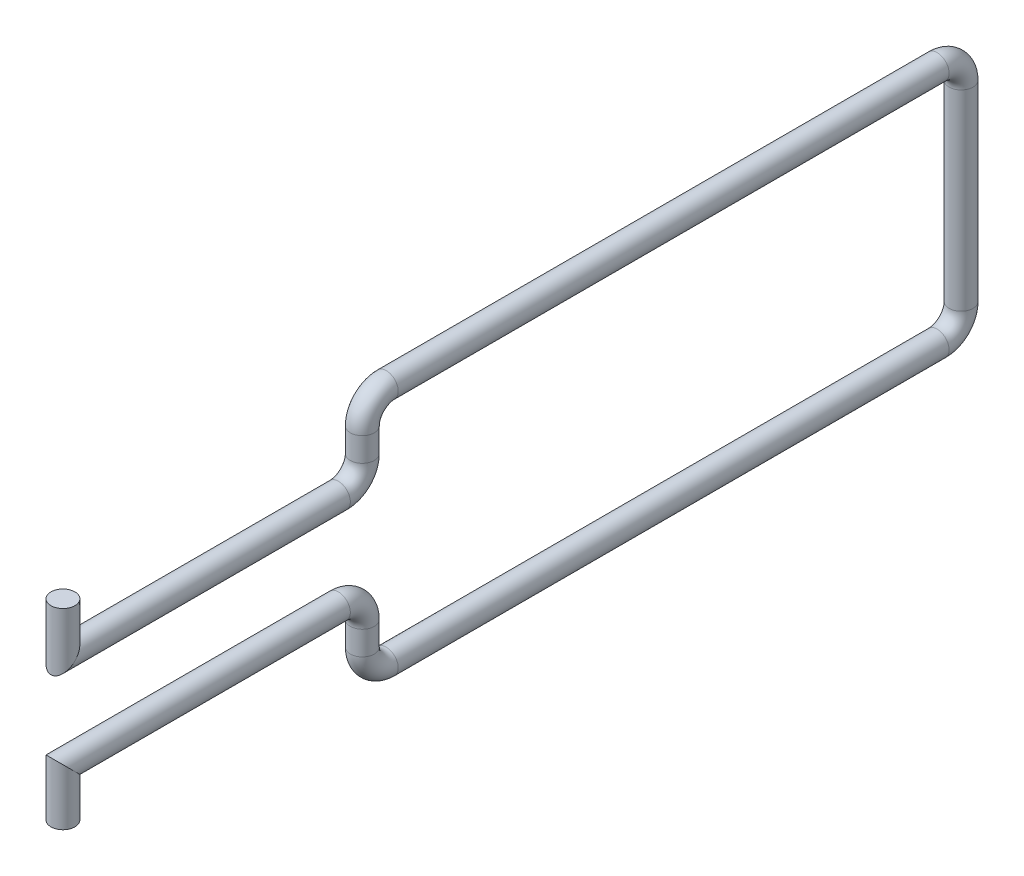
ISO-10303-21;
HEADER;
FILE_DESCRIPTION(('STEP AP214'),'2;1');
FILE_NAME('part.step','',(''),(''),'','','');
FILE_SCHEMA(('AUTOMOTIVE_DESIGN { 1 0 10303 214 1 1 1 1 }'));
ENDSEC;
DATA;
#1=APPLICATION_CONTEXT('core data for automotive mechanical design processes');
#2=APPLICATION_PROTOCOL_DEFINITION('international standard','automotive_design',2000,#1);
#3=PRODUCT_CONTEXT('',#1,'mechanical');
#4=PRODUCT('Part','Part','',(#3));
#5=PRODUCT_RELATED_PRODUCT_CATEGORY('part','',(#4));
#6=PRODUCT_DEFINITION_FORMATION('','',#4);
#7=PRODUCT_DEFINITION_CONTEXT('part definition',#1,'design');
#8=PRODUCT_DEFINITION('design','',#6,#7);
#9=PRODUCT_DEFINITION_SHAPE('','',#8);
#10=(LENGTH_UNIT() NAMED_UNIT(*) SI_UNIT(.MILLI.,.METRE.));
#11=(NAMED_UNIT(*) PLANE_ANGLE_UNIT() SI_UNIT($,.RADIAN.));
#12=(NAMED_UNIT(*) SI_UNIT($,.STERADIAN.) SOLID_ANGLE_UNIT());
#13=UNCERTAINTY_MEASURE_WITH_UNIT(LENGTH_MEASURE(1.E-05),#10,'distance_accuracy_value','');
#14=(GEOMETRIC_REPRESENTATION_CONTEXT(3) GLOBAL_UNCERTAINTY_ASSIGNED_CONTEXT((#13)) GLOBAL_UNIT_ASSIGNED_CONTEXT((#10,
#11,#12)) REPRESENTATION_CONTEXT('',''));
#15=CARTESIAN_POINT('',(0.,0.,0.));
#16=DIRECTION('',(0.,0.,1.));
#17=DIRECTION('',(1.,0.,0.));
#18=AXIS2_PLACEMENT_3D('',#15,#16,#17);
#19=CARTESIAN_POINT('',(0.,-3.99999999999999,0.));
#20=DIRECTION('',(0.,-1.,0.));
#21=DIRECTION('',(0.,0.,-1.));
#22=AXIS2_PLACEMENT_3D('',#19,#20,#21);
#23=CYLINDRICAL_SURFACE('',#22,1.);
#24=CARTESIAN_POINT('',(0.,-3.99999999999999,0.));
#25=DIRECTION('',(0.,-0.707106781186548,0.707106781186547));
#26=DIRECTION('',(0.,0.707106781186547,0.707106781186548));
#27=AXIS2_PLACEMENT_3D('',#24,#25,#26);
#28=ELLIPSE('',#27,1.4142135623731,1.);
#29=CARTESIAN_POINT('',(0.,-2.99999999999999,1.00000000000001));
#30=VERTEX_POINT('',#29);
#31=EDGE_CURVE('E40',#30,#30,#28,.F.);
#32=ORIENTED_EDGE('',*,*,#31,.F.);
#33=EDGE_LOOP('',(#32));
#34=FACE_BOUND('',#33,.T.);
#35=CARTESIAN_POINT('',(0.,-8.00000000000001,0.));
#36=DIRECTION('',(0.,-1.,0.));
#37=DIRECTION('',(0.,0.,-1.));
#38=AXIS2_PLACEMENT_3D('',#35,#36,#37);
#39=CIRCLE('',#38,1.);
#40=CARTESIAN_POINT('',(0.,-8.00000000000001,-0.999999999999987));
#41=VERTEX_POINT('',#40);
#42=EDGE_CURVE('E11',#41,#41,#39,.T.);
#43=ORIENTED_EDGE('',*,*,#42,.F.);
#44=EDGE_LOOP('',(#43));
#45=FACE_BOUND('',#44,.T.);
#46=ADVANCED_FACE('F34',(#34,#45),#23,.T.);
#47=CARTESIAN_POINT('',(0.,-3.99999999999999,-23.));
#48=DIRECTION('',(0.,0.,1.));
#49=DIRECTION('',(0.,-1.,0.));
#50=AXIS2_PLACEMENT_3D('',#47,#48,#49);
#51=CYLINDRICAL_SURFACE('',#50,1.);
#52=CARTESIAN_POINT('',(0.,-3.99999999999999,-23.));
#53=DIRECTION('',(0.,0.,1.));
#54=DIRECTION('',(0.,-1.,0.));
#55=AXIS2_PLACEMENT_3D('',#52,#53,#54);
#56=CIRCLE('',#55,1.);
#57=CARTESIAN_POINT('',(0.,-2.99999999999999,-23.));
#58=VERTEX_POINT('',#57);
#59=EDGE_CURVE('E44',#58,#58,#56,.T.);
#60=ORIENTED_EDGE('',*,*,#59,.T.);
#61=EDGE_LOOP('',(#60));
#62=FACE_BOUND('',#61,.T.);
#63=ORIENTED_EDGE('',*,*,#31,.T.);
#64=EDGE_LOOP('',(#63));
#65=FACE_BOUND('',#64,.T.);
#66=ADVANCED_FACE('F168',(#62,#65),#51,.T.);
#67=CARTESIAN_POINT('',(0.,-6.00000000000001,-23.));
#68=DIRECTION('',(1.,0.,0.));
#69=DIRECTION('',(0.,0.,-1.));
#70=AXIS2_PLACEMENT_3D('',#67,#68,#69);
#71=TOROIDAL_SURFACE('',#70,2.00000000000002,1.);
#72=CARTESIAN_POINT('',(0.,-5.99999999999999,-25.));
#73=DIRECTION('',(0.,1.,0.));
#74=DIRECTION('',(0.,0.,1.));
#75=AXIS2_PLACEMENT_3D('',#72,#73,#74);
#76=CIRCLE('',#75,1.);
#77=CARTESIAN_POINT('',(0.,-5.99999999999998,-26.));
#78=VERTEX_POINT('',#77);
#79=EDGE_CURVE('E48',#78,#78,#76,.T.);
#80=CARTESIAN_POINT('',(0.,-6.00000000000001,-23.));
#81=DIRECTION('',(1.,0.,0.));
#82=DIRECTION('',(0.,0.,-1.));
#83=AXIS2_PLACEMENT_3D('',#80,#81,#82);
#84=CIRCLE('',#83,3.00000000000002);
#85=EDGE_CURVE('',#78,#58,#84,.T.);
#86=ORIENTED_EDGE('',*,*,#79,.T.);
#87=ORIENTED_EDGE('',*,*,#59,.F.);
#88=ORIENTED_EDGE('',*,*,#85,.T.);
#89=ORIENTED_EDGE('',*,*,#85,.F.);
#90=EDGE_LOOP('',(#86,#88,#87,#89));
#91=FACE_BOUND('',#90,.T.);
#92=ADVANCED_FACE('F162',(#91),#71,.T.);
#93=CARTESIAN_POINT('',(0.,-7.99999999999999,-25.));
#94=DIRECTION('',(0.,1.,0.));
#95=DIRECTION('',(0.,0.,1.));
#96=AXIS2_PLACEMENT_3D('',#93,#94,#95);
#97=CYLINDRICAL_SURFACE('',#96,1.);
#98=CARTESIAN_POINT('',(0.,-7.99999999999999,-25.));
#99=DIRECTION('',(0.,1.,0.));
#100=DIRECTION('',(0.,0.,1.));
#101=AXIS2_PLACEMENT_3D('',#98,#99,#100);
#102=CIRCLE('',#101,1.);
#103=CARTESIAN_POINT('',(0.,-7.99999999999998,-24.));
#104=VERTEX_POINT('',#103);
#105=EDGE_CURVE('E53',#104,#104,#102,.T.);
#106=ORIENTED_EDGE('',*,*,#105,.T.);
#107=EDGE_LOOP('',(#106));
#108=FACE_BOUND('',#107,.T.);
#109=ORIENTED_EDGE('',*,*,#79,.F.);
#110=EDGE_LOOP('',(#109));
#111=FACE_BOUND('',#110,.T.);
#112=ADVANCED_FACE('F156',(#108,#111),#97,.T.);
#113=CARTESIAN_POINT('',(0.,-8.00000000000001,-27.));
#114=DIRECTION('',(-1.,0.,0.));
#115=DIRECTION('',(0.,0.,1.));
#116=AXIS2_PLACEMENT_3D('',#113,#114,#115);
#117=TOROIDAL_SURFACE('',#116,1.99999999999998,1.);
#118=CARTESIAN_POINT('',(0.,-9.99999999999998,-27.));
#119=DIRECTION('',(0.,0.,1.));
#120=DIRECTION('',(0.,-1.,0.));
#121=AXIS2_PLACEMENT_3D('',#118,#119,#120);
#122=CIRCLE('',#121,1.);
#123=CARTESIAN_POINT('',(0.,-11.,-27.));
#124=VERTEX_POINT('',#123);
#125=EDGE_CURVE('E56',#124,#124,#122,.T.);
#126=CARTESIAN_POINT('',(0.,-8.00000000000001,-27.));
#127=DIRECTION('',(-1.,0.,0.));
#128=DIRECTION('',(0.,0.,1.));
#129=AXIS2_PLACEMENT_3D('',#126,#127,#128);
#130=CIRCLE('',#129,2.99999999999998);
#131=EDGE_CURVE('',#124,#104,#130,.T.);
#132=ORIENTED_EDGE('',*,*,#125,.T.);
#133=ORIENTED_EDGE('',*,*,#105,.F.);
#134=ORIENTED_EDGE('',*,*,#131,.T.);
#135=ORIENTED_EDGE('',*,*,#131,.F.);
#136=EDGE_LOOP('',(#132,#134,#133,#135));
#137=FACE_BOUND('',#136,.T.);
#138=ADVANCED_FACE('F150',(#137),#117,.T.);
#139=CARTESIAN_POINT('',(0.,-9.99999999999998,-73.));
#140=DIRECTION('',(0.,0.,1.));
#141=DIRECTION('',(0.,-1.,0.));
#142=AXIS2_PLACEMENT_3D('',#139,#140,#141);
#143=CYLINDRICAL_SURFACE('',#142,1.);
#144=CARTESIAN_POINT('',(0.,-9.99999999999998,-73.));
#145=DIRECTION('',(0.,0.,1.));
#146=DIRECTION('',(0.,-1.,0.));
#147=AXIS2_PLACEMENT_3D('',#144,#145,#146);
#148=CIRCLE('',#147,1.);
#149=CARTESIAN_POINT('',(0.,-11.,-73.));
#150=VERTEX_POINT('',#149);
#151=EDGE_CURVE('E59',#150,#150,#148,.T.);
#152=ORIENTED_EDGE('',*,*,#151,.T.);
#153=EDGE_LOOP('',(#152));
#154=FACE_BOUND('',#153,.T.);
#155=ORIENTED_EDGE('',*,*,#125,.F.);
#156=EDGE_LOOP('',(#155));
#157=FACE_BOUND('',#156,.T.);
#158=ADVANCED_FACE('F144',(#154,#157),#143,.T.);
#159=CARTESIAN_POINT('',(0.,-8.,-73.));
#160=DIRECTION('',(-1.,0.,0.));
#161=DIRECTION('',(0.,0.,1.));
#162=AXIS2_PLACEMENT_3D('',#159,#160,#161);
#163=TOROIDAL_SURFACE('',#162,1.99999999999999,1.);
#164=CARTESIAN_POINT('',(0.,-8.00000000000001,-75.));
#165=DIRECTION('',(0.,-1.,0.));
#166=DIRECTION('',(0.,0.,-1.));
#167=AXIS2_PLACEMENT_3D('',#164,#165,#166);
#168=CIRCLE('',#167,1.);
#169=CARTESIAN_POINT('',(0.,-8.00000000000001,-76.));
#170=VERTEX_POINT('',#169);
#171=EDGE_CURVE('E62',#170,#170,#168,.T.);
#172=CARTESIAN_POINT('',(0.,-8.,-73.));
#173=DIRECTION('',(-1.,0.,0.));
#174=DIRECTION('',(0.,0.,1.));
#175=AXIS2_PLACEMENT_3D('',#172,#173,#174);
#176=CIRCLE('',#175,2.99999999999999);
#177=EDGE_CURVE('',#170,#150,#176,.T.);
#178=ORIENTED_EDGE('',*,*,#171,.T.);
#179=ORIENTED_EDGE('',*,*,#151,.F.);
#180=ORIENTED_EDGE('',*,*,#177,.T.);
#181=ORIENTED_EDGE('',*,*,#177,.F.);
#182=EDGE_LOOP('',(#178,#180,#179,#181));
#183=FACE_BOUND('',#182,.T.);
#184=ADVANCED_FACE('F138',(#183),#163,.T.);
#185=CARTESIAN_POINT('',(0.,7.99999999999999,-75.));
#186=DIRECTION('',(0.,-1.,0.));
#187=DIRECTION('',(0.,0.,-1.));
#188=AXIS2_PLACEMENT_3D('',#185,#186,#187);
#189=CYLINDRICAL_SURFACE('',#188,1.);
#190=CARTESIAN_POINT('',(0.,7.99999999999999,-75.));
#191=DIRECTION('',(0.,-1.,0.));
#192=DIRECTION('',(0.,0.,-1.));
#193=AXIS2_PLACEMENT_3D('',#190,#191,#192);
#194=CIRCLE('',#193,1.);
#195=CARTESIAN_POINT('',(0.,7.99999999999999,-76.));
#196=VERTEX_POINT('',#195);
#197=EDGE_CURVE('E65',#196,#196,#194,.T.);
#198=ORIENTED_EDGE('',*,*,#197,.T.);
#199=EDGE_LOOP('',(#198));
#200=FACE_BOUND('',#199,.T.);
#201=ORIENTED_EDGE('',*,*,#171,.F.);
#202=EDGE_LOOP('',(#201));
#203=FACE_BOUND('',#202,.T.);
#204=ADVANCED_FACE('F132',(#200,#203),#189,.T.);
#205=CARTESIAN_POINT('',(0.,8.,-73.));
#206=DIRECTION('',(-1.,0.,0.));
#207=DIRECTION('',(0.,0.,1.));
#208=AXIS2_PLACEMENT_3D('',#205,#206,#207);
#209=TOROIDAL_SURFACE('',#208,2.,1.);
#210=CARTESIAN_POINT('',(0.,10.,-73.));
#211=DIRECTION('',(0.,0.,-1.));
#212=DIRECTION('',(0.,1.,0.));
#213=AXIS2_PLACEMENT_3D('',#210,#211,#212);
#214=CIRCLE('',#213,1.);
#215=CARTESIAN_POINT('',(0.,11.,-73.));
#216=VERTEX_POINT('',#215);
#217=EDGE_CURVE('E68',#216,#216,#214,.T.);
#218=CARTESIAN_POINT('',(0.,8.,-73.));
#219=DIRECTION('',(-1.,0.,0.));
#220=DIRECTION('',(0.,0.,1.));
#221=AXIS2_PLACEMENT_3D('',#218,#219,#220);
#222=CIRCLE('',#221,3.);
#223=EDGE_CURVE('',#216,#196,#222,.T.);
#224=ORIENTED_EDGE('',*,*,#217,.T.);
#225=ORIENTED_EDGE('',*,*,#197,.F.);
#226=ORIENTED_EDGE('',*,*,#223,.T.);
#227=ORIENTED_EDGE('',*,*,#223,.F.);
#228=EDGE_LOOP('',(#224,#226,#225,#227));
#229=FACE_BOUND('',#228,.T.);
#230=ADVANCED_FACE('F126',(#229),#209,.T.);
#231=CARTESIAN_POINT('',(0.,10.,-27.));
#232=DIRECTION('',(0.,0.,-1.));
#233=DIRECTION('',(0.,1.,0.));
#234=AXIS2_PLACEMENT_3D('',#231,#232,#233);
#235=CYLINDRICAL_SURFACE('',#234,1.);
#236=CARTESIAN_POINT('',(0.,10.,-27.));
#237=DIRECTION('',(0.,0.,-1.));
#238=DIRECTION('',(0.,1.,0.));
#239=AXIS2_PLACEMENT_3D('',#236,#237,#238);
#240=CIRCLE('',#239,1.);
#241=CARTESIAN_POINT('',(0.,11.,-27.));
#242=VERTEX_POINT('',#241);
#243=EDGE_CURVE('E71',#242,#242,#240,.T.);
#244=ORIENTED_EDGE('',*,*,#243,.T.);
#245=EDGE_LOOP('',(#244));
#246=FACE_BOUND('',#245,.T.);
#247=ORIENTED_EDGE('',*,*,#217,.F.);
#248=EDGE_LOOP('',(#247));
#249=FACE_BOUND('',#248,.T.);
#250=ADVANCED_FACE('F120',(#246,#249),#235,.T.);
#251=CARTESIAN_POINT('',(0.,8.,-27.));
#252=DIRECTION('',(-1.,0.,0.));
#253=DIRECTION('',(0.,0.,1.));
#254=AXIS2_PLACEMENT_3D('',#251,#252,#253);
#255=TOROIDAL_SURFACE('',#254,2.,1.);
#256=CARTESIAN_POINT('',(0.,8.,-25.));
#257=DIRECTION('',(0.,1.,0.));
#258=DIRECTION('',(0.,0.,1.));
#259=AXIS2_PLACEMENT_3D('',#256,#257,#258);
#260=CIRCLE('',#259,1.);
#261=CARTESIAN_POINT('',(0.,8.,-24.));
#262=VERTEX_POINT('',#261);
#263=EDGE_CURVE('E74',#262,#262,#260,.T.);
#264=CARTESIAN_POINT('',(0.,8.,-27.));
#265=DIRECTION('',(-1.,0.,0.));
#266=DIRECTION('',(0.,0.,1.));
#267=AXIS2_PLACEMENT_3D('',#264,#265,#266);
#268=CIRCLE('',#267,3.);
#269=EDGE_CURVE('',#262,#242,#268,.T.);
#270=ORIENTED_EDGE('',*,*,#263,.T.);
#271=ORIENTED_EDGE('',*,*,#243,.F.);
#272=ORIENTED_EDGE('',*,*,#269,.T.);
#273=ORIENTED_EDGE('',*,*,#269,.F.);
#274=EDGE_LOOP('',(#270,#272,#271,#273));
#275=FACE_BOUND('',#274,.T.);
#276=ADVANCED_FACE('F114',(#275),#255,.T.);
#277=CARTESIAN_POINT('',(0.,6.,-25.));
#278=DIRECTION('',(0.,1.,0.));
#279=DIRECTION('',(0.,0.,1.));
#280=AXIS2_PLACEMENT_3D('',#277,#278,#279);
#281=CYLINDRICAL_SURFACE('',#280,1.);
#282=CARTESIAN_POINT('',(0.,6.,-25.));
#283=DIRECTION('',(0.,1.,0.));
#284=DIRECTION('',(0.,0.,1.));
#285=AXIS2_PLACEMENT_3D('',#282,#283,#284);
#286=CIRCLE('',#285,1.);
#287=CARTESIAN_POINT('',(0.,6.,-26.));
#288=VERTEX_POINT('',#287);
#289=EDGE_CURVE('E77',#288,#288,#286,.T.);
#290=ORIENTED_EDGE('',*,*,#289,.T.);
#291=EDGE_LOOP('',(#290));
#292=FACE_BOUND('',#291,.T.);
#293=ORIENTED_EDGE('',*,*,#263,.F.);
#294=EDGE_LOOP('',(#293));
#295=FACE_BOUND('',#294,.T.);
#296=ADVANCED_FACE('F108',(#292,#295),#281,.T.);
#297=CARTESIAN_POINT('',(0.,6.,-23.));
#298=DIRECTION('',(1.,0.,0.));
#299=DIRECTION('',(0.,0.,-1.));
#300=AXIS2_PLACEMENT_3D('',#297,#298,#299);
#301=TOROIDAL_SURFACE('',#300,2.,1.);
#302=CARTESIAN_POINT('',(0.,4.,-23.));
#303=DIRECTION('',(0.,0.,-1.));
#304=DIRECTION('',(0.,1.,0.));
#305=AXIS2_PLACEMENT_3D('',#302,#303,#304);
#306=CIRCLE('',#305,1.);
#307=CARTESIAN_POINT('',(0.,3.,-23.));
#308=VERTEX_POINT('',#307);
#309=EDGE_CURVE('E80',#308,#308,#306,.T.);
#310=CARTESIAN_POINT('',(0.,6.,-23.));
#311=DIRECTION('',(1.,0.,0.));
#312=DIRECTION('',(0.,0.,-1.));
#313=AXIS2_PLACEMENT_3D('',#310,#311,#312);
#314=CIRCLE('',#313,3.);
#315=EDGE_CURVE('',#308,#288,#314,.T.);
#316=ORIENTED_EDGE('',*,*,#309,.T.);
#317=ORIENTED_EDGE('',*,*,#289,.F.);
#318=ORIENTED_EDGE('',*,*,#315,.T.);
#319=ORIENTED_EDGE('',*,*,#315,.F.);
#320=EDGE_LOOP('',(#316,#318,#317,#319));
#321=FACE_BOUND('',#320,.T.);
#322=ADVANCED_FACE('F102',(#321),#301,.T.);
#323=CARTESIAN_POINT('',(0.,4.,0.));
#324=DIRECTION('',(0.,0.,-1.));
#325=DIRECTION('',(-1.,0.,0.));
#326=AXIS2_PLACEMENT_3D('',#323,#324,#325);
#327=CYLINDRICAL_SURFACE('',#326,1.);
#328=CARTESIAN_POINT('',(0.,4.,0.));
#329=DIRECTION('',(0.,-0.707106781186548,-0.707106781186548));
#330=DIRECTION('',(0.,0.707106781186548,-0.707106781186548));
#331=AXIS2_PLACEMENT_3D('',#328,#329,#330);
#332=ELLIPSE('',#331,1.41421356237309,1.);
#333=CARTESIAN_POINT('',(0.,5.,-1.));
#334=VERTEX_POINT('',#333);
#335=EDGE_CURVE('E83',#334,#334,#332,.F.);
#336=ORIENTED_EDGE('',*,*,#335,.F.);
#337=EDGE_LOOP('',(#336));
#338=FACE_BOUND('',#337,.T.);
#339=ORIENTED_EDGE('',*,*,#309,.F.);
#340=EDGE_LOOP('',(#339));
#341=FACE_BOUND('',#340,.T.);
#342=ADVANCED_FACE('F99',(#338,#341),#327,.T.);
#343=CARTESIAN_POINT('',(0.,8.,0.));
#344=DIRECTION('',(0.,1.,0.));
#345=DIRECTION('',(0.,0.,1.));
#346=AXIS2_PLACEMENT_3D('',#343,#344,#345);
#347=PLANE('',#346);
#348=CARTESIAN_POINT('',(0.,8.,0.));
#349=DIRECTION('',(0.,1.,0.));
#350=DIRECTION('',(0.,0.,1.));
#351=AXIS2_PLACEMENT_3D('',#348,#349,#350);
#352=CIRCLE('',#351,1.);
#353=CARTESIAN_POINT('',(0.,8.,1.));
#354=VERTEX_POINT('',#353);
#355=EDGE_CURVE('E86',#354,#354,#352,.T.);
#356=ORIENTED_EDGE('',*,*,#355,.T.);
#357=EDGE_LOOP('',(#356));
#358=FACE_BOUND('',#357,.T.);
#359=ADVANCED_FACE('F90',(#358),#347,.T.);
#360=CARTESIAN_POINT('',(0.,1.17157287525381,0.));
#361=DIRECTION('',(0.,1.,0.));
#362=DIRECTION('',(0.,0.,1.));
#363=AXIS2_PLACEMENT_3D('',#360,#361,#362);
#364=CYLINDRICAL_SURFACE('',#363,1.);
#365=ORIENTED_EDGE('',*,*,#355,.F.);
#366=EDGE_LOOP('',(#365));
#367=FACE_BOUND('',#366,.T.);
#368=ORIENTED_EDGE('',*,*,#335,.T.);
#369=EDGE_LOOP('',(#368));
#370=FACE_BOUND('',#369,.T.);
#371=ADVANCED_FACE('F92',(#367,#370),#364,.T.);
#372=CARTESIAN_POINT('',(0.,-8.00000000000001,0.));
#373=DIRECTION('',(0.,-1.,0.));
#374=DIRECTION('',(0.,0.,-1.));
#375=AXIS2_PLACEMENT_3D('',#372,#373,#374);
#376=PLANE('',#375);
#377=ORIENTED_EDGE('',*,*,#42,.T.);
#378=EDGE_LOOP('',(#377));
#379=FACE_BOUND('',#378,.T.);
#380=ADVANCED_FACE('F95',(#379),#376,.T.);
#381=CLOSED_SHELL('',(#46,#66,#92,#112,#138,#158,#184,#204,#230,#250,#276,#296,#322,#342,#359,
#371,#380));
#382=MANIFOLD_SOLID_BREP('B2',#381);
#383=ADVANCED_BREP_SHAPE_REPRESENTATION('',(#18,#382),#14);
#384=SHAPE_DEFINITION_REPRESENTATION(#9,#383);
ENDSEC;
END-ISO-10303-21;
